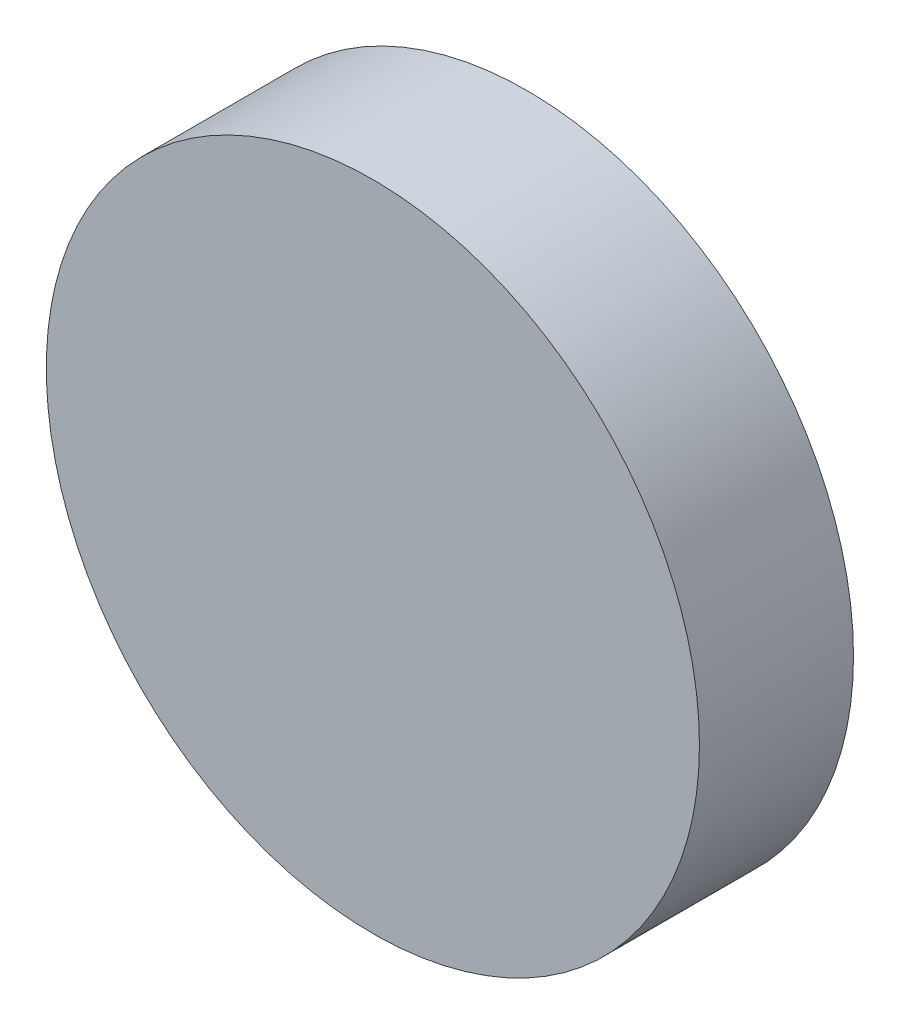
ISO-10303-21;
HEADER;
FILE_DESCRIPTION(('STEP AP214'),'2;1');
FILE_NAME('part.step','',(''),(''),'','','');
FILE_SCHEMA(('AUTOMOTIVE_DESIGN { 1 0 10303 214 1 1 1 1 }'));
ENDSEC;
DATA;
#1=APPLICATION_CONTEXT('core data for automotive mechanical design processes');
#2=APPLICATION_PROTOCOL_DEFINITION('international standard','automotive_design',2000,#1);
#3=PRODUCT_CONTEXT('',#1,'mechanical');
#4=PRODUCT('Part','Part','',(#3));
#5=PRODUCT_RELATED_PRODUCT_CATEGORY('part','',(#4));
#6=PRODUCT_DEFINITION_FORMATION('','',#4);
#7=PRODUCT_DEFINITION_CONTEXT('part definition',#1,'design');
#8=PRODUCT_DEFINITION('design','',#6,#7);
#9=PRODUCT_DEFINITION_SHAPE('','',#8);
#10=(LENGTH_UNIT() NAMED_UNIT(*) SI_UNIT(.MILLI.,.METRE.));
#11=(NAMED_UNIT(*) PLANE_ANGLE_UNIT() SI_UNIT($,.RADIAN.));
#12=(NAMED_UNIT(*) SI_UNIT($,.STERADIAN.) SOLID_ANGLE_UNIT());
#13=UNCERTAINTY_MEASURE_WITH_UNIT(LENGTH_MEASURE(1.E-05),#10,'distance_accuracy_value','');
#14=(GEOMETRIC_REPRESENTATION_CONTEXT(3) GLOBAL_UNCERTAINTY_ASSIGNED_CONTEXT((#13)) GLOBAL_UNIT_ASSIGNED_CONTEXT((#10,
#11,#12)) REPRESENTATION_CONTEXT('',''));
#15=CARTESIAN_POINT('',(0.,0.,0.));
#16=DIRECTION('',(0.,0.,1.));
#17=DIRECTION('',(1.,0.,0.));
#18=AXIS2_PLACEMENT_3D('',#15,#16,#17);
#19=CARTESIAN_POINT('',(0.,0.,23.368));
#20=DIRECTION('',(0.,0.,-1.));
#21=DIRECTION('',(-1.,0.,0.));
#22=AXIS2_PLACEMENT_3D('',#19,#20,#21);
#23=CYLINDRICAL_SURFACE('',#22,49.53);
#24=CARTESIAN_POINT('',(0.,0.,23.368));
#25=DIRECTION('',(0.,0.,1.));
#26=DIRECTION('',(1.,0.,0.));
#27=AXIS2_PLACEMENT_3D('',#24,#25,#26);
#28=CIRCLE('',#27,49.53);
#29=CARTESIAN_POINT('',(49.53,0.,23.368));
#30=VERTEX_POINT('',#29);
#31=EDGE_CURVE('E10',#30,#30,#28,.T.);
#32=ORIENTED_EDGE('',*,*,#31,.F.);
#33=EDGE_LOOP('',(#32));
#34=FACE_BOUND('',#33,.T.);
#35=CARTESIAN_POINT('',(0.,0.,0.));
#36=DIRECTION('',(0.,0.,1.));
#37=DIRECTION('',(1.,0.,0.));
#38=AXIS2_PLACEMENT_3D('',#35,#36,#37);
#39=CIRCLE('',#38,49.53);
#40=CARTESIAN_POINT('',(49.53,0.,0.));
#41=VERTEX_POINT('',#40);
#42=EDGE_CURVE('E34',#41,#41,#39,.T.);
#43=ORIENTED_EDGE('',*,*,#42,.T.);
#44=EDGE_LOOP('',(#43));
#45=FACE_BOUND('',#44,.T.);
#46=ADVANCED_FACE('F31',(#34,#45),#23,.T.);
#47=CARTESIAN_POINT('',(0.,0.,23.368));
#48=DIRECTION('',(0.,0.,1.));
#49=DIRECTION('',(1.,0.,0.));
#50=AXIS2_PLACEMENT_3D('',#47,#48,#49);
#51=PLANE('',#50);
#52=ORIENTED_EDGE('',*,*,#31,.T.);
#53=EDGE_LOOP('',(#52));
#54=FACE_BOUND('',#53,.T.);
#55=ADVANCED_FACE('F46',(#54),#51,.T.);
#56=CARTESIAN_POINT('',(0.,0.,0.));
#57=DIRECTION('',(0.,0.,1.));
#58=DIRECTION('',(1.,0.,0.));
#59=AXIS2_PLACEMENT_3D('',#56,#57,#58);
#60=PLANE('',#59);
#61=ORIENTED_EDGE('',*,*,#42,.F.);
#62=EDGE_LOOP('',(#61));
#63=FACE_BOUND('',#62,.T.);
#64=ADVANCED_FACE('F44',(#63),#60,.F.);
#65=CLOSED_SHELL('',(#46,#55,#64));
#66=MANIFOLD_SOLID_BREP('B2',#65);
#67=ADVANCED_BREP_SHAPE_REPRESENTATION('',(#18,#66),#14);
#68=SHAPE_DEFINITION_REPRESENTATION(#9,#67);
ENDSEC;
END-ISO-10303-21;
